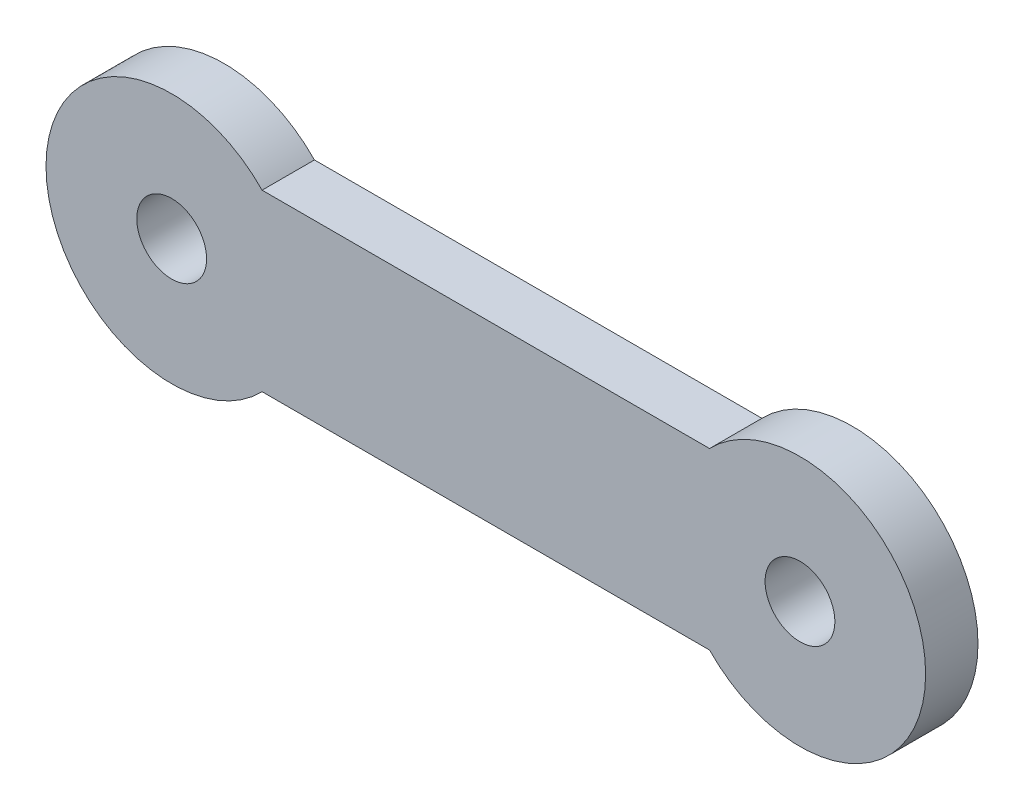
ISO-10303-21;
HEADER;
FILE_DESCRIPTION(('STEP AP214'),'2;1');
FILE_NAME('part.step','',(''),(''),'','','');
FILE_SCHEMA(('AUTOMOTIVE_DESIGN { 1 0 10303 214 1 1 1 1 }'));
ENDSEC;
DATA;
#1=APPLICATION_CONTEXT('core data for automotive mechanical design processes');
#2=APPLICATION_PROTOCOL_DEFINITION('international standard','automotive_design',2000,#1);
#3=PRODUCT_CONTEXT('',#1,'mechanical');
#4=PRODUCT('Part','Part','',(#3));
#5=PRODUCT_RELATED_PRODUCT_CATEGORY('part','',(#4));
#6=PRODUCT_DEFINITION_FORMATION('','',#4);
#7=PRODUCT_DEFINITION_CONTEXT('part definition',#1,'design');
#8=PRODUCT_DEFINITION('design','',#6,#7);
#9=PRODUCT_DEFINITION_SHAPE('','',#8);
#10=(LENGTH_UNIT() NAMED_UNIT(*) SI_UNIT(.MILLI.,.METRE.));
#11=(NAMED_UNIT(*) PLANE_ANGLE_UNIT() SI_UNIT($,.RADIAN.));
#12=(NAMED_UNIT(*) SI_UNIT($,.STERADIAN.) SOLID_ANGLE_UNIT());
#13=UNCERTAINTY_MEASURE_WITH_UNIT(LENGTH_MEASURE(1.E-05),#10,'distance_accuracy_value','');
#14=(GEOMETRIC_REPRESENTATION_CONTEXT(3) GLOBAL_UNCERTAINTY_ASSIGNED_CONTEXT((#13)) GLOBAL_UNIT_ASSIGNED_CONTEXT((#10,
#11,#12)) REPRESENTATION_CONTEXT('',''));
#15=CARTESIAN_POINT('',(0.,0.,0.));
#16=DIRECTION('',(0.,0.,1.));
#17=DIRECTION('',(1.,0.,0.));
#18=AXIS2_PLACEMENT_3D('',#15,#16,#17);
#19=CARTESIAN_POINT('',(18.,0.,1.5));
#20=DIRECTION('',(0.,0.,-1.));
#21=DIRECTION('',(-1.,0.,0.));
#22=AXIS2_PLACEMENT_3D('',#19,#20,#21);
#23=CYLINDRICAL_SURFACE('',#22,3.6);
#24=CARTESIAN_POINT('',(18.,0.,0.));
#25=DIRECTION('',(0.,0.,1.));
#26=DIRECTION('',(1.,0.,0.));
#27=AXIS2_PLACEMENT_3D('',#24,#25,#26);
#28=CIRCLE('',#27,3.6);
#29=CARTESIAN_POINT('',(15.4096332306023,-2.5,0.));
#30=VERTEX_POINT('',#29);
#31=CARTESIAN_POINT('',(15.4096332306023,2.5,0.));
#32=VERTEX_POINT('',#31);
#33=EDGE_CURVE('E100',#30,#32,#28,.T.);
#34=ORIENTED_EDGE('',*,*,#33,.T.);
#35=DIRECTION('',(0.,0.,-1.));
#36=VECTOR('',#35,1.);
#37=CARTESIAN_POINT('',(15.4096332306023,2.5,1.5));
#38=LINE('',#37,#36);
#39=CARTESIAN_POINT('',(15.4096332306023,2.5,1.5));
#40=VERTEX_POINT('',#39);
#41=EDGE_CURVE('E11',#40,#32,#38,.T.);
#42=ORIENTED_EDGE('',*,*,#41,.F.);
#43=CARTESIAN_POINT('',(18.,0.,1.5));
#44=DIRECTION('',(0.,0.,1.));
#45=DIRECTION('',(1.,0.,0.));
#46=AXIS2_PLACEMENT_3D('',#43,#44,#45);
#47=CIRCLE('',#46,3.6);
#48=CARTESIAN_POINT('',(15.4096332306023,-2.5,1.5));
#49=VERTEX_POINT('',#48);
#50=EDGE_CURVE('E88',#49,#40,#47,.T.);
#51=ORIENTED_EDGE('',*,*,#50,.F.);
#52=DIRECTION('',(0.,0.,-1.));
#53=VECTOR('',#52,1.);
#54=CARTESIAN_POINT('',(15.4096332306023,-2.5,1.5));
#55=LINE('',#54,#53);
#56=EDGE_CURVE('E96',#49,#30,#55,.T.);
#57=ORIENTED_EDGE('',*,*,#56,.T.);
#58=EDGE_LOOP('',(#34,#42,#51,#57));
#59=FACE_BOUND('',#58,.T.);
#60=ADVANCED_FACE('F37',(#59),#23,.T.);
#61=CARTESIAN_POINT('',(2.59036676939772,2.5,1.5));
#62=DIRECTION('',(0.,-1.,0.));
#63=DIRECTION('',(0.,0.,-1.));
#64=AXIS2_PLACEMENT_3D('',#61,#62,#63);
#65=PLANE('',#64);
#66=DIRECTION('',(-1.,0.,0.));
#67=VECTOR('',#66,1.);
#68=CARTESIAN_POINT('',(2.59036676939772,2.5,0.));
#69=LINE('',#68,#67);
#70=CARTESIAN_POINT('',(2.59036676939772,2.5,0.));
#71=VERTEX_POINT('',#70);
#72=EDGE_CURVE('E92',#32,#71,#69,.T.);
#73=ORIENTED_EDGE('',*,*,#72,.T.);
#74=DIRECTION('',(0.,0.,-1.));
#75=VECTOR('',#74,1.);
#76=CARTESIAN_POINT('',(2.59036676939772,2.5,1.5));
#77=LINE('',#76,#75);
#78=CARTESIAN_POINT('',(2.59036676939772,2.5,1.5));
#79=VERTEX_POINT('',#78);
#80=EDGE_CURVE('E45',#79,#71,#77,.T.);
#81=ORIENTED_EDGE('',*,*,#80,.F.);
#82=DIRECTION('',(-1.,0.,0.));
#83=VECTOR('',#82,1.);
#84=CARTESIAN_POINT('',(2.59036676939772,2.5,1.5));
#85=LINE('',#84,#83);
#86=EDGE_CURVE('E83',#40,#79,#85,.T.);
#87=ORIENTED_EDGE('',*,*,#86,.F.);
#88=ORIENTED_EDGE('',*,*,#41,.T.);
#89=EDGE_LOOP('',(#73,#81,#87,#88));
#90=FACE_BOUND('',#89,.T.);
#91=ADVANCED_FACE('F91',(#90),#65,.F.);
#92=CARTESIAN_POINT('',(0.,0.,1.5));
#93=DIRECTION('',(0.,0.,-1.));
#94=DIRECTION('',(-1.,0.,0.));
#95=AXIS2_PLACEMENT_3D('',#92,#93,#94);
#96=CYLINDRICAL_SURFACE('',#95,3.6);
#97=CARTESIAN_POINT('',(0.,0.,0.));
#98=DIRECTION('',(0.,0.,1.));
#99=DIRECTION('',(1.,0.,0.));
#100=AXIS2_PLACEMENT_3D('',#97,#98,#99);
#101=CIRCLE('',#100,3.6);
#102=CARTESIAN_POINT('',(2.59036676939772,-2.5,0.));
#103=VERTEX_POINT('',#102);
#104=EDGE_CURVE('E70',#71,#103,#101,.T.);
#105=ORIENTED_EDGE('',*,*,#104,.T.);
#106=DIRECTION('',(0.,0.,-1.));
#107=VECTOR('',#106,1.);
#108=CARTESIAN_POINT('',(2.59036676939772,-2.5,1.5));
#109=LINE('',#108,#107);
#110=CARTESIAN_POINT('',(2.59036676939772,-2.5,1.5));
#111=VERTEX_POINT('',#110);
#112=EDGE_CURVE('E93',#111,#103,#109,.T.);
#113=ORIENTED_EDGE('',*,*,#112,.F.);
#114=CARTESIAN_POINT('',(0.,0.,1.5));
#115=DIRECTION('',(0.,0.,1.));
#116=DIRECTION('',(1.,0.,0.));
#117=AXIS2_PLACEMENT_3D('',#114,#115,#116);
#118=CIRCLE('',#117,3.6);
#119=EDGE_CURVE('E86',#79,#111,#118,.T.);
#120=ORIENTED_EDGE('',*,*,#119,.F.);
#121=ORIENTED_EDGE('',*,*,#80,.T.);
#122=EDGE_LOOP('',(#105,#113,#120,#121));
#123=FACE_BOUND('',#122,.T.);
#124=ADVANCED_FACE('F94',(#123),#96,.T.);
#125=CARTESIAN_POINT('',(2.59036676939772,-2.5,1.5));
#126=DIRECTION('',(0.,1.,0.));
#127=DIRECTION('',(0.,0.,1.));
#128=AXIS2_PLACEMENT_3D('',#125,#126,#127);
#129=PLANE('',#128);
#130=DIRECTION('',(1.,0.,0.));
#131=VECTOR('',#130,1.);
#132=CARTESIAN_POINT('',(2.59036676939772,-2.5,0.));
#133=LINE('',#132,#131);
#134=EDGE_CURVE('E76',#103,#30,#133,.T.);
#135=ORIENTED_EDGE('',*,*,#134,.T.);
#136=ORIENTED_EDGE('',*,*,#56,.F.);
#137=DIRECTION('',(1.,0.,0.));
#138=VECTOR('',#137,1.);
#139=CARTESIAN_POINT('',(2.59036676939772,-2.5,1.5));
#140=LINE('',#139,#138);
#141=EDGE_CURVE('E53',#111,#49,#140,.T.);
#142=ORIENTED_EDGE('',*,*,#141,.F.);
#143=ORIENTED_EDGE('',*,*,#112,.T.);
#144=EDGE_LOOP('',(#135,#136,#142,#143));
#145=FACE_BOUND('',#144,.T.);
#146=ADVANCED_FACE('F108',(#145),#129,.F.);
#147=CARTESIAN_POINT('',(18.,0.,1.5));
#148=DIRECTION('',(0.,0.,1.));
#149=DIRECTION('',(1.,0.,0.));
#150=AXIS2_PLACEMENT_3D('',#147,#148,#149);
#151=PLANE('',#150);
#152=CARTESIAN_POINT('',(0.,0.,1.5));
#153=DIRECTION('',(0.,0.,1.));
#154=DIRECTION('',(1.,0.,0.));
#155=AXIS2_PLACEMENT_3D('',#152,#153,#154);
#156=CIRCLE('',#155,1.);
#157=CARTESIAN_POINT('',(1.,0.,1.5));
#158=VERTEX_POINT('',#157);
#159=EDGE_CURVE('E120',#158,#158,#156,.T.);
#160=ORIENTED_EDGE('',*,*,#159,.F.);
#161=EDGE_LOOP('',(#160));
#162=FACE_BOUND('',#161,.T.);
#163=CARTESIAN_POINT('',(18.,0.,1.5));
#164=DIRECTION('',(0.,0.,1.));
#165=DIRECTION('',(1.,0.,0.));
#166=AXIS2_PLACEMENT_3D('',#163,#164,#165);
#167=CIRCLE('',#166,1.);
#168=CARTESIAN_POINT('',(19.,0.,1.5));
#169=VERTEX_POINT('',#168);
#170=EDGE_CURVE('E114',#169,#169,#167,.T.);
#171=ORIENTED_EDGE('',*,*,#170,.F.);
#172=EDGE_LOOP('',(#171));
#173=FACE_BOUND('',#172,.T.);
#174=ORIENTED_EDGE('',*,*,#50,.T.);
#175=ORIENTED_EDGE('',*,*,#86,.T.);
#176=ORIENTED_EDGE('',*,*,#119,.T.);
#177=ORIENTED_EDGE('',*,*,#141,.T.);
#178=EDGE_LOOP('',(#174,#175,#176,#177));
#179=FACE_BOUND('',#178,.T.);
#180=ADVANCED_FACE('F84',(#162,#173,#179),#151,.T.);
#181=CARTESIAN_POINT('',(18.,0.,0.));
#182=DIRECTION('',(0.,0.,1.));
#183=DIRECTION('',(1.,0.,0.));
#184=AXIS2_PLACEMENT_3D('',#181,#182,#183);
#185=PLANE('',#184);
#186=CARTESIAN_POINT('',(0.,0.,0.));
#187=DIRECTION('',(0.,0.,1.));
#188=DIRECTION('',(1.,0.,0.));
#189=AXIS2_PLACEMENT_3D('',#186,#187,#188);
#190=CIRCLE('',#189,1.);
#191=CARTESIAN_POINT('',(1.,0.,0.));
#192=VERTEX_POINT('',#191);
#193=EDGE_CURVE('E103',#192,#192,#190,.T.);
#194=ORIENTED_EDGE('',*,*,#193,.T.);
#195=EDGE_LOOP('',(#194));
#196=FACE_BOUND('',#195,.T.);
#197=CARTESIAN_POINT('',(18.,0.,0.));
#198=DIRECTION('',(0.,0.,1.));
#199=DIRECTION('',(1.,0.,0.));
#200=AXIS2_PLACEMENT_3D('',#197,#198,#199);
#201=CIRCLE('',#200,1.);
#202=CARTESIAN_POINT('',(19.,0.,0.));
#203=VERTEX_POINT('',#202);
#204=EDGE_CURVE('E117',#203,#203,#201,.T.);
#205=ORIENTED_EDGE('',*,*,#204,.T.);
#206=EDGE_LOOP('',(#205));
#207=FACE_BOUND('',#206,.T.);
#208=ORIENTED_EDGE('',*,*,#33,.F.);
#209=ORIENTED_EDGE('',*,*,#134,.F.);
#210=ORIENTED_EDGE('',*,*,#104,.F.);
#211=ORIENTED_EDGE('',*,*,#72,.F.);
#212=EDGE_LOOP('',(#208,#209,#210,#211));
#213=FACE_BOUND('',#212,.T.);
#214=ADVANCED_FACE('F111',(#196,#207,#213),#185,.F.);
#215=CARTESIAN_POINT('',(18.,0.,0.));
#216=DIRECTION('',(0.,0.,1.));
#217=DIRECTION('',(1.,0.,0.));
#218=AXIS2_PLACEMENT_3D('',#215,#216,#217);
#219=CYLINDRICAL_SURFACE('',#218,1.);
#220=ORIENTED_EDGE('',*,*,#204,.F.);
#221=EDGE_LOOP('',(#220));
#222=FACE_BOUND('',#221,.T.);
#223=ORIENTED_EDGE('',*,*,#170,.T.);
#224=EDGE_LOOP('',(#223));
#225=FACE_BOUND('',#224,.T.);
#226=ADVANCED_FACE('F131',(#222,#225),#219,.F.);
#227=CARTESIAN_POINT('',(0.,0.,0.));
#228=DIRECTION('',(0.,0.,1.));
#229=DIRECTION('',(1.,0.,0.));
#230=AXIS2_PLACEMENT_3D('',#227,#228,#229);
#231=CYLINDRICAL_SURFACE('',#230,1.);
#232=ORIENTED_EDGE('',*,*,#193,.F.);
#233=EDGE_LOOP('',(#232));
#234=FACE_BOUND('',#233,.T.);
#235=ORIENTED_EDGE('',*,*,#159,.T.);
#236=EDGE_LOOP('',(#235));
#237=FACE_BOUND('',#236,.T.);
#238=ADVANCED_FACE('F128',(#234,#237),#231,.F.);
#239=CLOSED_SHELL('',(#60,#91,#124,#146,#180,#214,#226,#238));
#240=MANIFOLD_SOLID_BREP('B2',#239);
#241=ADVANCED_BREP_SHAPE_REPRESENTATION('',(#18,#240),#14);
#242=SHAPE_DEFINITION_REPRESENTATION(#9,#241);
ENDSEC;
END-ISO-10303-21;
